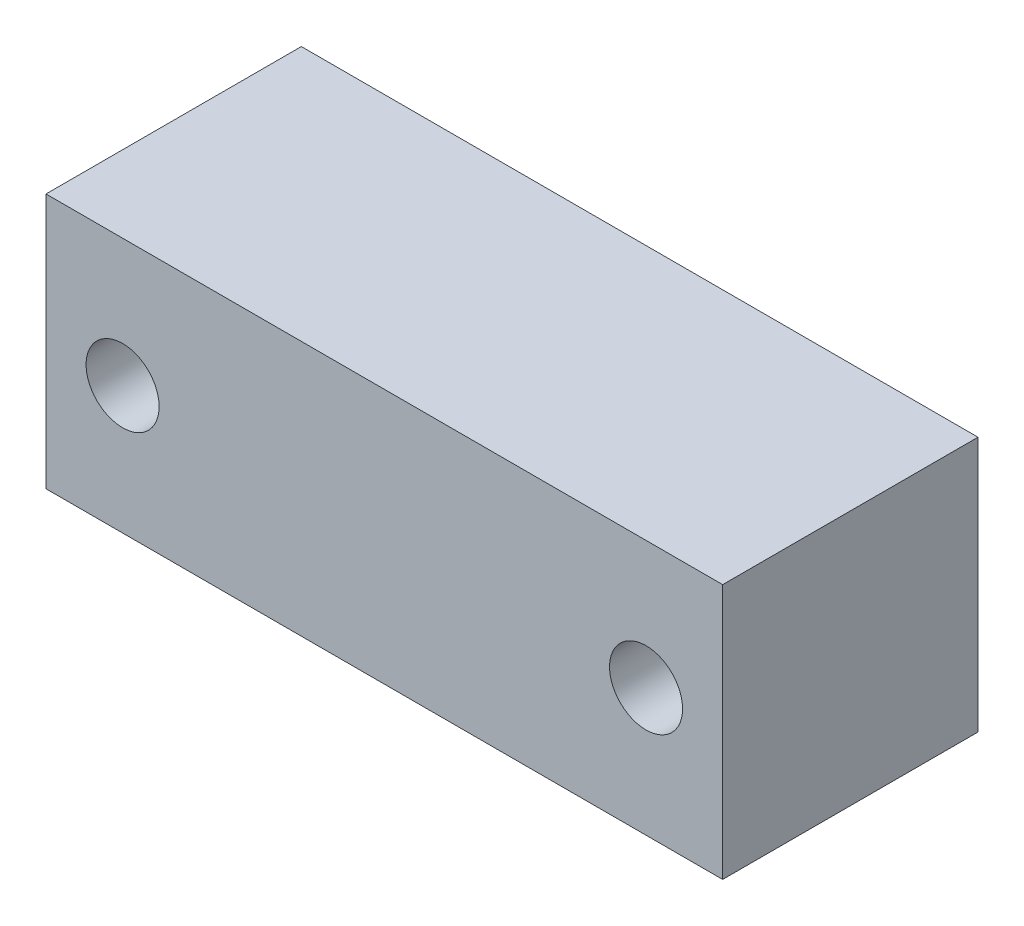
ISO-10303-21;
HEADER;
FILE_DESCRIPTION(('STEP AP214'),'2;1');
FILE_NAME('part.step','',(''),(''),'','','');
FILE_SCHEMA(('AUTOMOTIVE_DESIGN { 1 0 10303 214 1 1 1 1 }'));
ENDSEC;
DATA;
#1=APPLICATION_CONTEXT('core data for automotive mechanical design processes');
#2=APPLICATION_PROTOCOL_DEFINITION('international standard','automotive_design',2000,#1);
#3=PRODUCT_CONTEXT('',#1,'mechanical');
#4=PRODUCT('Part','Part','',(#3));
#5=PRODUCT_RELATED_PRODUCT_CATEGORY('part','',(#4));
#6=PRODUCT_DEFINITION_FORMATION('','',#4);
#7=PRODUCT_DEFINITION_CONTEXT('part definition',#1,'design');
#8=PRODUCT_DEFINITION('design','',#6,#7);
#9=PRODUCT_DEFINITION_SHAPE('','',#8);
#10=(LENGTH_UNIT() NAMED_UNIT(*) SI_UNIT(.MILLI.,.METRE.));
#11=(NAMED_UNIT(*) PLANE_ANGLE_UNIT() SI_UNIT($,.RADIAN.));
#12=(NAMED_UNIT(*) SI_UNIT($,.STERADIAN.) SOLID_ANGLE_UNIT());
#13=UNCERTAINTY_MEASURE_WITH_UNIT(LENGTH_MEASURE(1.E-05),#10,'distance_accuracy_value','');
#14=(GEOMETRIC_REPRESENTATION_CONTEXT(3) GLOBAL_UNCERTAINTY_ASSIGNED_CONTEXT((#13)) GLOBAL_UNIT_ASSIGNED_CONTEXT((#10,
#11,#12)) REPRESENTATION_CONTEXT('',''));
#15=CARTESIAN_POINT('',(0.,0.,0.));
#16=DIRECTION('',(0.,0.,1.));
#17=DIRECTION('',(1.,0.,0.));
#18=AXIS2_PLACEMENT_3D('',#15,#16,#17);
#19=CARTESIAN_POINT('',(26.5,10.,20.));
#20=DIRECTION('',(-1.,0.,0.));
#21=DIRECTION('',(0.,-1.,0.));
#22=AXIS2_PLACEMENT_3D('',#19,#20,#21);
#23=PLANE('',#22);
#24=DIRECTION('',(0.,1.,0.));
#25=VECTOR('',#24,1.);
#26=CARTESIAN_POINT('',(26.5,10.,0.));
#27=LINE('',#26,#25);
#28=CARTESIAN_POINT('',(26.5,-10.,0.));
#29=VERTEX_POINT('',#28);
#30=CARTESIAN_POINT('',(26.5,10.,0.));
#31=VERTEX_POINT('',#30);
#32=EDGE_CURVE('E111',#29,#31,#27,.T.);
#33=ORIENTED_EDGE('',*,*,#32,.T.);
#34=DIRECTION('',(0.,0.,-1.));
#35=VECTOR('',#34,1.);
#36=CARTESIAN_POINT('',(26.5,10.,20.));
#37=LINE('',#36,#35);
#38=CARTESIAN_POINT('',(26.5,10.,20.));
#39=VERTEX_POINT('',#38);
#40=EDGE_CURVE('E11',#39,#31,#37,.T.);
#41=ORIENTED_EDGE('',*,*,#40,.F.);
#42=DIRECTION('',(0.,1.,0.));
#43=VECTOR('',#42,1.);
#44=CARTESIAN_POINT('',(26.5,10.,20.));
#45=LINE('',#44,#43);
#46=CARTESIAN_POINT('',(26.5,-10.,20.));
#47=VERTEX_POINT('',#46);
#48=EDGE_CURVE('E95',#47,#39,#45,.T.);
#49=ORIENTED_EDGE('',*,*,#48,.F.);
#50=DIRECTION('',(0.,0.,-1.));
#51=VECTOR('',#50,1.);
#52=CARTESIAN_POINT('',(26.5,-10.,20.));
#53=LINE('',#52,#51);
#54=EDGE_CURVE('E107',#47,#29,#53,.T.);
#55=ORIENTED_EDGE('',*,*,#54,.T.);
#56=EDGE_LOOP('',(#33,#41,#49,#55));
#57=FACE_BOUND('',#56,.T.);
#58=ADVANCED_FACE('F43',(#57),#23,.F.);
#59=CARTESIAN_POINT('',(-26.5,10.,20.));
#60=DIRECTION('',(0.,-1.,0.));
#61=DIRECTION('',(0.,0.,-1.));
#62=AXIS2_PLACEMENT_3D('',#59,#60,#61);
#63=PLANE('',#62);
#64=DIRECTION('',(-1.,0.,0.));
#65=VECTOR('',#64,1.);
#66=CARTESIAN_POINT('',(-26.5,10.,0.));
#67=LINE('',#66,#65);
#68=CARTESIAN_POINT('',(-26.5,10.,0.));
#69=VERTEX_POINT('',#68);
#70=EDGE_CURVE('E100',#31,#69,#67,.T.);
#71=ORIENTED_EDGE('',*,*,#70,.T.);
#72=DIRECTION('',(0.,0.,-1.));
#73=VECTOR('',#72,1.);
#74=CARTESIAN_POINT('',(-26.5,10.,20.));
#75=LINE('',#74,#73);
#76=CARTESIAN_POINT('',(-26.5,10.,20.));
#77=VERTEX_POINT('',#76);
#78=EDGE_CURVE('E52',#77,#69,#75,.T.);
#79=ORIENTED_EDGE('',*,*,#78,.F.);
#80=DIRECTION('',(-1.,0.,0.));
#81=VECTOR('',#80,1.);
#82=CARTESIAN_POINT('',(-26.5,10.,20.));
#83=LINE('',#82,#81);
#84=EDGE_CURVE('E90',#39,#77,#83,.T.);
#85=ORIENTED_EDGE('',*,*,#84,.F.);
#86=ORIENTED_EDGE('',*,*,#40,.T.);
#87=EDGE_LOOP('',(#71,#79,#85,#86));
#88=FACE_BOUND('',#87,.T.);
#89=ADVANCED_FACE('F99',(#88),#63,.F.);
#90=CARTESIAN_POINT('',(-26.5,10.,20.));
#91=DIRECTION('',(1.,0.,0.));
#92=DIRECTION('',(0.,0.,-1.));
#93=AXIS2_PLACEMENT_3D('',#90,#91,#92);
#94=PLANE('',#93);
#95=DIRECTION('',(0.,-1.,0.));
#96=VECTOR('',#95,1.);
#97=CARTESIAN_POINT('',(-26.5,10.,0.));
#98=LINE('',#97,#96);
#99=CARTESIAN_POINT('',(-26.5,-10.,0.));
#100=VERTEX_POINT('',#99);
#101=EDGE_CURVE('E77',#69,#100,#98,.T.);
#102=ORIENTED_EDGE('',*,*,#101,.T.);
#103=DIRECTION('',(0.,0.,-1.));
#104=VECTOR('',#103,1.);
#105=CARTESIAN_POINT('',(-26.5,-10.,20.));
#106=LINE('',#105,#104);
#107=CARTESIAN_POINT('',(-26.5,-10.,20.));
#108=VERTEX_POINT('',#107);
#109=EDGE_CURVE('E102',#108,#100,#106,.T.);
#110=ORIENTED_EDGE('',*,*,#109,.F.);
#111=DIRECTION('',(0.,-1.,0.));
#112=VECTOR('',#111,1.);
#113=CARTESIAN_POINT('',(-26.5,10.,20.));
#114=LINE('',#113,#112);
#115=EDGE_CURVE('E93',#77,#108,#114,.T.);
#116=ORIENTED_EDGE('',*,*,#115,.F.);
#117=ORIENTED_EDGE('',*,*,#78,.T.);
#118=EDGE_LOOP('',(#102,#110,#116,#117));
#119=FACE_BOUND('',#118,.T.);
#120=ADVANCED_FACE('F103',(#119),#94,.F.);
#121=CARTESIAN_POINT('',(-26.5,-10.,20.));
#122=DIRECTION('',(0.,1.,0.));
#123=DIRECTION('',(0.,0.,1.));
#124=AXIS2_PLACEMENT_3D('',#121,#122,#123);
#125=PLANE('',#124);
#126=DIRECTION('',(1.,0.,0.));
#127=VECTOR('',#126,1.);
#128=CARTESIAN_POINT('',(-26.5,-10.,0.));
#129=LINE('',#128,#127);
#130=EDGE_CURVE('E83',#100,#29,#129,.T.);
#131=ORIENTED_EDGE('',*,*,#130,.T.);
#132=ORIENTED_EDGE('',*,*,#54,.F.);
#133=DIRECTION('',(1.,0.,0.));
#134=VECTOR('',#133,1.);
#135=CARTESIAN_POINT('',(-26.5,-10.,20.));
#136=LINE('',#135,#134);
#137=EDGE_CURVE('E60',#108,#47,#136,.T.);
#138=ORIENTED_EDGE('',*,*,#137,.F.);
#139=ORIENTED_EDGE('',*,*,#109,.T.);
#140=EDGE_LOOP('',(#131,#132,#138,#139));
#141=FACE_BOUND('',#140,.T.);
#142=ADVANCED_FACE('F125',(#141),#125,.F.);
#143=CARTESIAN_POINT('',(0.,0.,20.));
#144=DIRECTION('',(0.,0.,1.));
#145=DIRECTION('',(1.,0.,0.));
#146=AXIS2_PLACEMENT_3D('',#143,#144,#145);
#147=PLANE('',#146);
#148=CARTESIAN_POINT('',(-20.5,0.,20.));
#149=DIRECTION('',(0.,0.,1.));
#150=DIRECTION('',(1.,0.,0.));
#151=AXIS2_PLACEMENT_3D('',#148,#149,#150);
#152=CIRCLE('',#151,2.86);
#153=CARTESIAN_POINT('',(-17.64,0.,20.));
#154=VERTEX_POINT('',#153);
#155=EDGE_CURVE('E143',#154,#154,#152,.T.);
#156=ORIENTED_EDGE('',*,*,#155,.F.);
#157=EDGE_LOOP('',(#156));
#158=FACE_BOUND('',#157,.T.);
#159=CARTESIAN_POINT('',(20.5,0.,20.));
#160=DIRECTION('',(0.,0.,1.));
#161=DIRECTION('',(1.,0.,0.));
#162=AXIS2_PLACEMENT_3D('',#159,#160,#161);
#163=CIRCLE('',#162,2.86);
#164=CARTESIAN_POINT('',(23.36,0.,20.));
#165=VERTEX_POINT('',#164);
#166=EDGE_CURVE('E135',#165,#165,#163,.T.);
#167=ORIENTED_EDGE('',*,*,#166,.F.);
#168=EDGE_LOOP('',(#167));
#169=FACE_BOUND('',#168,.T.);
#170=ORIENTED_EDGE('',*,*,#48,.T.);
#171=ORIENTED_EDGE('',*,*,#84,.T.);
#172=ORIENTED_EDGE('',*,*,#115,.T.);
#173=ORIENTED_EDGE('',*,*,#137,.T.);
#174=EDGE_LOOP('',(#170,#171,#172,#173));
#175=FACE_BOUND('',#174,.T.);
#176=ADVANCED_FACE('F91',(#158,#169,#175),#147,.T.);
#177=CARTESIAN_POINT('',(0.,0.,0.));
#178=DIRECTION('',(0.,0.,1.));
#179=DIRECTION('',(1.,0.,0.));
#180=AXIS2_PLACEMENT_3D('',#177,#178,#179);
#181=PLANE('',#180);
#182=CARTESIAN_POINT('',(-20.5,0.,0.));
#183=DIRECTION('',(0.,0.,1.));
#184=DIRECTION('',(1.,0.,0.));
#185=AXIS2_PLACEMENT_3D('',#182,#183,#184);
#186=CIRCLE('',#185,2.85999999999999);
#187=CARTESIAN_POINT('',(-17.64,0.,0.));
#188=VERTEX_POINT('',#187);
#189=EDGE_CURVE('E139',#188,#188,#186,.T.);
#190=ORIENTED_EDGE('',*,*,#189,.T.);
#191=EDGE_LOOP('',(#190));
#192=FACE_BOUND('',#191,.T.);
#193=CARTESIAN_POINT('',(20.5,0.,0.));
#194=DIRECTION('',(0.,0.,1.));
#195=DIRECTION('',(1.,0.,0.));
#196=AXIS2_PLACEMENT_3D('',#193,#194,#195);
#197=CIRCLE('',#196,2.85999999999999);
#198=CARTESIAN_POINT('',(23.36,0.,0.));
#199=VERTEX_POINT('',#198);
#200=EDGE_CURVE('E115',#199,#199,#197,.T.);
#201=ORIENTED_EDGE('',*,*,#200,.T.);
#202=EDGE_LOOP('',(#201));
#203=FACE_BOUND('',#202,.T.);
#204=ORIENTED_EDGE('',*,*,#32,.F.);
#205=ORIENTED_EDGE('',*,*,#130,.F.);
#206=ORIENTED_EDGE('',*,*,#101,.F.);
#207=ORIENTED_EDGE('',*,*,#70,.F.);
#208=EDGE_LOOP('',(#204,#205,#206,#207));
#209=FACE_BOUND('',#208,.T.);
#210=ADVANCED_FACE('F128',(#192,#203,#209),#181,.F.);
#211=CARTESIAN_POINT('',(20.5,0.,20.));
#212=DIRECTION('',(0.,0.,1.));
#213=DIRECTION('',(1.,0.,0.));
#214=AXIS2_PLACEMENT_3D('',#211,#212,#213);
#215=CYLINDRICAL_SURFACE('',#214,2.86);
#216=ORIENTED_EDGE('',*,*,#200,.F.);
#217=EDGE_LOOP('',(#216));
#218=FACE_BOUND('',#217,.T.);
#219=ORIENTED_EDGE('',*,*,#166,.T.);
#220=EDGE_LOOP('',(#219));
#221=FACE_BOUND('',#220,.T.);
#222=ADVANCED_FACE('F155',(#218,#221),#215,.F.);
#223=CARTESIAN_POINT('',(-20.5,0.,20.));
#224=DIRECTION('',(0.,0.,1.));
#225=DIRECTION('',(1.,0.,0.));
#226=AXIS2_PLACEMENT_3D('',#223,#224,#225);
#227=CYLINDRICAL_SURFACE('',#226,2.86);
#228=ORIENTED_EDGE('',*,*,#189,.F.);
#229=EDGE_LOOP('',(#228));
#230=FACE_BOUND('',#229,.T.);
#231=ORIENTED_EDGE('',*,*,#155,.T.);
#232=EDGE_LOOP('',(#231));
#233=FACE_BOUND('',#232,.T.);
#234=ADVANCED_FACE('F148',(#230,#233),#227,.F.);
#235=CLOSED_SHELL('',(#58,#89,#120,#142,#176,#210,#222,#234));
#236=MANIFOLD_SOLID_BREP('B2',#235);
#237=ADVANCED_BREP_SHAPE_REPRESENTATION('',(#18,#236),#14);
#238=SHAPE_DEFINITION_REPRESENTATION(#9,#237);
ENDSEC;
END-ISO-10303-21;
